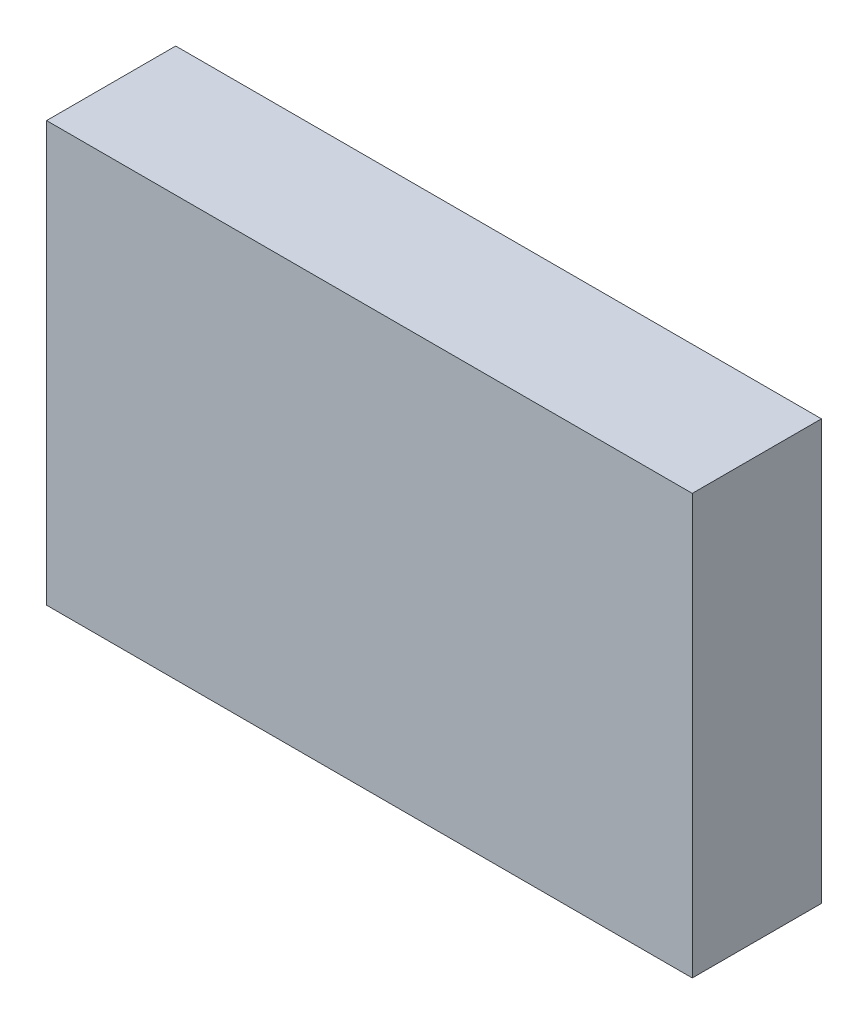
ISO-10303-21;
HEADER;
FILE_DESCRIPTION(('STEP AP214'),'2;1');
FILE_NAME('part.step','',(''),(''),'','','');
FILE_SCHEMA(('AUTOMOTIVE_DESIGN { 1 0 10303 214 1 1 1 1 }'));
ENDSEC;
DATA;
#1=APPLICATION_CONTEXT('core data for automotive mechanical design processes');
#2=APPLICATION_PROTOCOL_DEFINITION('international standard','automotive_design',2000,#1);
#3=PRODUCT_CONTEXT('',#1,'mechanical');
#4=PRODUCT('Part','Part','',(#3));
#5=PRODUCT_RELATED_PRODUCT_CATEGORY('part','',(#4));
#6=PRODUCT_DEFINITION_FORMATION('','',#4);
#7=PRODUCT_DEFINITION_CONTEXT('part definition',#1,'design');
#8=PRODUCT_DEFINITION('design','',#6,#7);
#9=PRODUCT_DEFINITION_SHAPE('','',#8);
#10=(LENGTH_UNIT() NAMED_UNIT(*) SI_UNIT(.MILLI.,.METRE.));
#11=(NAMED_UNIT(*) PLANE_ANGLE_UNIT() SI_UNIT($,.RADIAN.));
#12=(NAMED_UNIT(*) SI_UNIT($,.STERADIAN.) SOLID_ANGLE_UNIT());
#13=UNCERTAINTY_MEASURE_WITH_UNIT(LENGTH_MEASURE(1.E-05),#10,'distance_accuracy_value','');
#14=(GEOMETRIC_REPRESENTATION_CONTEXT(3) GLOBAL_UNCERTAINTY_ASSIGNED_CONTEXT((#13)) GLOBAL_UNIT_ASSIGNED_CONTEXT((#10,
#11,#12)) REPRESENTATION_CONTEXT('',''));
#15=CARTESIAN_POINT('',(0.,0.,0.));
#16=DIRECTION('',(0.,0.,1.));
#17=DIRECTION('',(1.,0.,0.));
#18=AXIS2_PLACEMENT_3D('',#15,#16,#17);
#19=CARTESIAN_POINT('',(0.05,0.,0.45));
#20=DIRECTION('',(0.,0.,1.));
#21=DIRECTION('',(1.,0.,0.));
#22=AXIS2_PLACEMENT_3D('',#19,#20,#21);
#23=PLANE('',#22);
#24=DIRECTION('',(0.,1.,0.));
#25=VECTOR('',#24,1.);
#26=CARTESIAN_POINT('',(2.05,0.,0.45));
#27=LINE('',#26,#25);
#28=CARTESIAN_POINT('',(2.05,1.3,0.45));
#29=VERTEX_POINT('',#28);
#30=CARTESIAN_POINT('',(2.05,0.,0.45));
#31=VERTEX_POINT('',#30);
#32=EDGE_CURVE('E76',#29,#31,#27,.F.);
#33=ORIENTED_EDGE('',*,*,#32,.F.);
#34=DIRECTION('',(1.,0.,0.));
#35=VECTOR('',#34,1.);
#36=CARTESIAN_POINT('',(0.05,1.3,0.45));
#37=LINE('',#36,#35);
#38=CARTESIAN_POINT('',(0.05,1.3,0.45));
#39=VERTEX_POINT('',#38);
#40=EDGE_CURVE('E58',#39,#29,#37,.T.);
#41=ORIENTED_EDGE('',*,*,#40,.F.);
#42=DIRECTION('',(0.,1.,0.));
#43=VECTOR('',#42,1.);
#44=CARTESIAN_POINT('',(0.05,0.,0.45));
#45=LINE('',#44,#43);
#46=CARTESIAN_POINT('',(0.05,0.,0.45));
#47=VERTEX_POINT('',#46);
#48=EDGE_CURVE('E20',#39,#47,#45,.F.);
#49=ORIENTED_EDGE('',*,*,#48,.T.);
#50=DIRECTION('',(1.,0.,0.));
#51=VECTOR('',#50,1.);
#52=CARTESIAN_POINT('',(0.05,0.,0.45));
#53=LINE('',#52,#51);
#54=EDGE_CURVE('E55',#47,#31,#53,.T.);
#55=ORIENTED_EDGE('',*,*,#54,.T.);
#56=EDGE_LOOP('',(#33,#41,#49,#55));
#57=FACE_BOUND('',#56,.T.);
#58=ADVANCED_FACE('F17',(#57),#23,.T.);
#59=CARTESIAN_POINT('',(0.05,0.,0.05));
#60=DIRECTION('',(1.,0.,0.));
#61=DIRECTION('',(0.,0.,-1.));
#62=AXIS2_PLACEMENT_3D('',#59,#60,#61);
#63=PLANE('',#62);
#64=DIRECTION('',(0.,0.,1.));
#65=VECTOR('',#64,1.);
#66=CARTESIAN_POINT('',(0.05,1.3,0.05));
#67=LINE('',#66,#65);
#68=CARTESIAN_POINT('',(0.05,1.3,0.05));
#69=VERTEX_POINT('',#68);
#70=EDGE_CURVE('E78',#69,#39,#67,.T.);
#71=ORIENTED_EDGE('',*,*,#70,.F.);
#72=DIRECTION('',(0.,1.,0.));
#73=VECTOR('',#72,1.);
#74=CARTESIAN_POINT('',(0.05,0.,0.05));
#75=LINE('',#74,#73);
#76=CARTESIAN_POINT('',(0.05,0.,0.05));
#77=VERTEX_POINT('',#76);
#78=EDGE_CURVE('E73',#69,#77,#75,.F.);
#79=ORIENTED_EDGE('',*,*,#78,.T.);
#80=DIRECTION('',(0.,0.,1.));
#81=VECTOR('',#80,1.);
#82=CARTESIAN_POINT('',(0.05,0.,0.05));
#83=LINE('',#82,#81);
#84=EDGE_CURVE('E63',#77,#47,#83,.T.);
#85=ORIENTED_EDGE('',*,*,#84,.T.);
#86=ORIENTED_EDGE('',*,*,#48,.F.);
#87=EDGE_LOOP('',(#71,#79,#85,#86));
#88=FACE_BOUND('',#87,.T.);
#89=ADVANCED_FACE('F72',(#88),#63,.F.);
#90=CARTESIAN_POINT('',(0.05,0.,0.05));
#91=DIRECTION('',(0.,1.,0.));
#92=DIRECTION('',(0.,0.,1.));
#93=AXIS2_PLACEMENT_3D('',#90,#91,#92);
#94=PLANE('',#93);
#95=ORIENTED_EDGE('',*,*,#54,.F.);
#96=ORIENTED_EDGE('',*,*,#84,.F.);
#97=DIRECTION('',(1.,0.,0.));
#98=VECTOR('',#97,1.);
#99=CARTESIAN_POINT('',(0.05,0.,0.05));
#100=LINE('',#99,#98);
#101=CARTESIAN_POINT('',(2.05,0.,0.05));
#102=VERTEX_POINT('',#101);
#103=EDGE_CURVE('E83',#77,#102,#100,.T.);
#104=ORIENTED_EDGE('',*,*,#103,.T.);
#105=DIRECTION('',(0.,0.,-1.));
#106=VECTOR('',#105,1.);
#107=CARTESIAN_POINT('',(2.05,0.,0.05));
#108=LINE('',#107,#106);
#109=EDGE_CURVE('E69',#31,#102,#108,.T.);
#110=ORIENTED_EDGE('',*,*,#109,.F.);
#111=EDGE_LOOP('',(#95,#96,#104,#110));
#112=FACE_BOUND('',#111,.T.);
#113=ADVANCED_FACE('F66',(#112),#94,.F.);
#114=CARTESIAN_POINT('',(2.05,0.,0.05));
#115=DIRECTION('',(1.,0.,0.));
#116=DIRECTION('',(0.,0.,-1.));
#117=AXIS2_PLACEMENT_3D('',#114,#115,#116);
#118=PLANE('',#117);
#119=DIRECTION('',(0.,0.,1.));
#120=VECTOR('',#119,1.);
#121=CARTESIAN_POINT('',(2.05,1.3,0.05));
#122=LINE('',#121,#120);
#123=CARTESIAN_POINT('',(2.05,1.3,0.05));
#124=VERTEX_POINT('',#123);
#125=EDGE_CURVE('E34',#29,#124,#122,.F.);
#126=ORIENTED_EDGE('',*,*,#125,.F.);
#127=ORIENTED_EDGE('',*,*,#32,.T.);
#128=ORIENTED_EDGE('',*,*,#109,.T.);
#129=DIRECTION('',(0.,1.,0.));
#130=VECTOR('',#129,1.);
#131=CARTESIAN_POINT('',(2.05,0.,0.05));
#132=LINE('',#131,#130);
#133=EDGE_CURVE('E26',#102,#124,#132,.T.);
#134=ORIENTED_EDGE('',*,*,#133,.T.);
#135=EDGE_LOOP('',(#126,#127,#128,#134));
#136=FACE_BOUND('',#135,.T.);
#137=ADVANCED_FACE('F88',(#136),#118,.T.);
#138=CARTESIAN_POINT('',(0.05,1.3,0.05));
#139=DIRECTION('',(0.,1.,0.));
#140=DIRECTION('',(0.,0.,1.));
#141=AXIS2_PLACEMENT_3D('',#138,#139,#140);
#142=PLANE('',#141);
#143=ORIENTED_EDGE('',*,*,#40,.T.);
#144=ORIENTED_EDGE('',*,*,#125,.T.);
#145=DIRECTION('',(1.,0.,0.));
#146=VECTOR('',#145,1.);
#147=CARTESIAN_POINT('',(0.05,1.3,0.05));
#148=LINE('',#147,#146);
#149=EDGE_CURVE('E11',#124,#69,#148,.F.);
#150=ORIENTED_EDGE('',*,*,#149,.T.);
#151=ORIENTED_EDGE('',*,*,#70,.T.);
#152=EDGE_LOOP('',(#143,#144,#150,#151));
#153=FACE_BOUND('',#152,.T.);
#154=ADVANCED_FACE('F91',(#153),#142,.T.);
#155=CARTESIAN_POINT('',(0.05,0.,0.05));
#156=DIRECTION('',(0.,0.,1.));
#157=DIRECTION('',(1.,0.,0.));
#158=AXIS2_PLACEMENT_3D('',#155,#156,#157);
#159=PLANE('',#158);
#160=ORIENTED_EDGE('',*,*,#133,.F.);
#161=ORIENTED_EDGE('',*,*,#103,.F.);
#162=ORIENTED_EDGE('',*,*,#78,.F.);
#163=ORIENTED_EDGE('',*,*,#149,.F.);
#164=EDGE_LOOP('',(#160,#161,#162,#163));
#165=FACE_BOUND('',#164,.T.);
#166=ADVANCED_FACE('F90',(#165),#159,.F.);
#167=CLOSED_SHELL('',(#58,#89,#113,#137,#154,#166));
#168=MANIFOLD_SOLID_BREP('B1',#167);
#169=ADVANCED_BREP_SHAPE_REPRESENTATION('',(#18,#168),#14);
#170=SHAPE_DEFINITION_REPRESENTATION(#9,#169);
ENDSEC;
END-ISO-10303-21;
